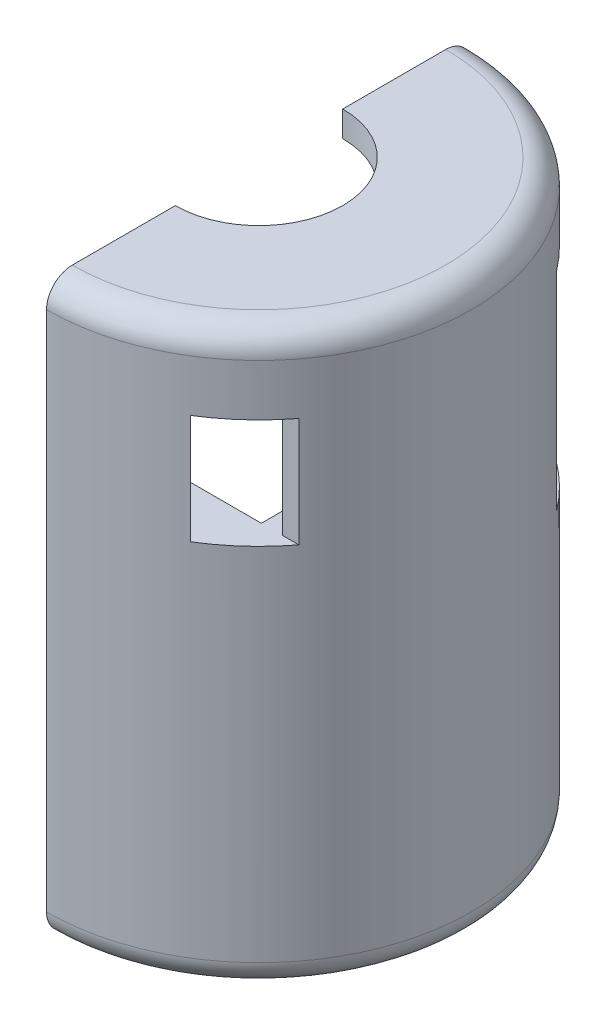
ISO-10303-21;
HEADER;
FILE_DESCRIPTION(('STEP AP214'),'2;1');
FILE_NAME('part.step','',(''),(''),'','','');
FILE_SCHEMA(('AUTOMOTIVE_DESIGN { 1 0 10303 214 1 1 1 1 }'));
ENDSEC;
DATA;
#1=APPLICATION_CONTEXT('core data for automotive mechanical design processes');
#2=APPLICATION_PROTOCOL_DEFINITION('international standard','automotive_design',2000,#1);
#3=PRODUCT_CONTEXT('',#1,'mechanical');
#4=PRODUCT('Part','Part','',(#3));
#5=PRODUCT_RELATED_PRODUCT_CATEGORY('part','',(#4));
#6=PRODUCT_DEFINITION_FORMATION('','',#4);
#7=PRODUCT_DEFINITION_CONTEXT('part definition',#1,'design');
#8=PRODUCT_DEFINITION('design','',#6,#7);
#9=PRODUCT_DEFINITION_SHAPE('','',#8);
#10=(LENGTH_UNIT() NAMED_UNIT(*) SI_UNIT(.MILLI.,.METRE.));
#11=(NAMED_UNIT(*) PLANE_ANGLE_UNIT() SI_UNIT($,.RADIAN.));
#12=(NAMED_UNIT(*) SI_UNIT($,.STERADIAN.) SOLID_ANGLE_UNIT());
#13=UNCERTAINTY_MEASURE_WITH_UNIT(LENGTH_MEASURE(1.E-05),#10,'distance_accuracy_value','');
#14=(GEOMETRIC_REPRESENTATION_CONTEXT(3) GLOBAL_UNCERTAINTY_ASSIGNED_CONTEXT((#13)) GLOBAL_UNIT_ASSIGNED_CONTEXT((#10,
#11,#12)) REPRESENTATION_CONTEXT('',''));
#15=CARTESIAN_POINT('',(0.,0.,0.));
#16=DIRECTION('',(0.,0.,1.));
#17=DIRECTION('',(1.,0.,0.));
#18=AXIS2_PLACEMENT_3D('',#15,#16,#17);
#19=CARTESIAN_POINT('',(88.,36.5,-4.));
#20=DIRECTION('',(0.,-1.,0.));
#21=DIRECTION('',(0.,0.,-1.));
#22=AXIS2_PLACEMENT_3D('',#19,#20,#21);
#23=PLANE('',#22);
#24=DIRECTION('',(0.,0.,-1.));
#25=VECTOR('',#24,1.);
#26=CARTESIAN_POINT('',(40.2,36.5,20.));
#27=LINE('',#26,#25);
#28=CARTESIAN_POINT('',(40.2,36.5,20.));
#29=VERTEX_POINT('',#28);
#30=CARTESIAN_POINT('',(40.2,36.5,0.));
#31=VERTEX_POINT('',#30);
#32=EDGE_CURVE('E188',#29,#31,#27,.T.);
#33=ORIENTED_EDGE('',*,*,#32,.T.);
#34=DIRECTION('',(-1.,0.,0.));
#35=VECTOR('',#34,1.);
#36=CARTESIAN_POINT('',(88.,36.5,0.));
#37=LINE('',#36,#35);
#38=CARTESIAN_POINT('',(30.,36.5,0.));
#39=VERTEX_POINT('',#38);
#40=EDGE_CURVE('E34',#31,#39,#37,.T.);
#41=ORIENTED_EDGE('',*,*,#40,.T.);
#42=DIRECTION('',(0.,0.,1.));
#43=VECTOR('',#42,1.);
#44=CARTESIAN_POINT('',(30.,36.5,-4.));
#45=LINE('',#44,#43);
#46=CARTESIAN_POINT('',(30.,36.5,-4.));
#47=VERTEX_POINT('',#46);
#48=EDGE_CURVE('E279',#47,#39,#45,.T.);
#49=ORIENTED_EDGE('',*,*,#48,.F.);
#50=DIRECTION('',(-1.,0.,0.));
#51=VECTOR('',#50,1.);
#52=CARTESIAN_POINT('',(88.,36.5,-4.));
#53=LINE('',#52,#51);
#54=CARTESIAN_POINT('',(38.7623643644877,36.5,-4.));
#55=VERTEX_POINT('',#54);
#56=EDGE_CURVE('E292',#47,#55,#53,.F.);
#57=ORIENTED_EDGE('',*,*,#56,.T.);
#58=CARTESIAN_POINT('',(30.,36.5,9.98109333149438));
#59=DIRECTION('',(0.,-1.,0.));
#60=DIRECTION('',(0.,0.,-1.));
#61=AXIS2_PLACEMENT_3D('',#58,#59,#60);
#62=CIRCLE('',#61,16.5);
#63=CARTESIAN_POINT('',(43.1387889817897,36.5,0.));
#64=VERTEX_POINT('',#63);
#65=EDGE_CURVE('E408',#64,#55,#62,.F.);
#66=ORIENTED_EDGE('',*,*,#65,.F.);
#67=DIRECTION('',(-1.,0.,0.));
#68=VECTOR('',#67,1.);
#69=CARTESIAN_POINT('',(88.,36.5,0.));
#70=LINE('',#69,#68);
#71=CARTESIAN_POINT('',(41.8586582676119,36.5,0.));
#72=VERTEX_POINT('',#71);
#73=EDGE_CURVE('E290',#72,#64,#70,.F.);
#74=ORIENTED_EDGE('',*,*,#73,.F.);
#75=CARTESIAN_POINT('',(30.,36.5,9.98109333149438));
#76=DIRECTION('',(0.,1.,0.));
#77=DIRECTION('',(0.,0.,1.));
#78=AXIS2_PLACEMENT_3D('',#75,#76,#77);
#79=CIRCLE('',#78,15.5);
#80=CARTESIAN_POINT('',(41.8267285911098,36.5,20.));
#81=VERTEX_POINT('',#80);
#82=EDGE_CURVE('E238',#81,#72,#79,.T.);
#83=ORIENTED_EDGE('',*,*,#82,.F.);
#84=DIRECTION('',(-1.,0.,0.));
#85=VECTOR('',#84,1.);
#86=CARTESIAN_POINT('',(88.,36.5,20.));
#87=LINE('',#86,#85);
#88=CARTESIAN_POINT('',(43.1099774663335,36.5,20.));
#89=VERTEX_POINT('',#88);
#90=EDGE_CURVE('E195',#81,#89,#87,.F.);
#91=ORIENTED_EDGE('',*,*,#90,.T.);
#92=CARTESIAN_POINT('',(30.,36.5,9.98109333149438));
#93=DIRECTION('',(0.,-1.,0.));
#94=DIRECTION('',(0.,0.,-1.));
#95=AXIS2_PLACEMENT_3D('',#92,#93,#94);
#96=CIRCLE('',#95,16.5);
#97=CARTESIAN_POINT('',(38.7017386664809,36.5,24.));
#98=VERTEX_POINT('',#97);
#99=EDGE_CURVE('E26',#98,#89,#96,.F.);
#100=ORIENTED_EDGE('',*,*,#99,.F.);
#101=DIRECTION('',(-1.,0.,0.));
#102=VECTOR('',#101,1.);
#103=CARTESIAN_POINT('',(88.,36.5,24.));
#104=LINE('',#103,#102);
#105=CARTESIAN_POINT('',(30.,36.5,24.));
#106=VERTEX_POINT('',#105);
#107=EDGE_CURVE('E267',#106,#98,#104,.F.);
#108=ORIENTED_EDGE('',*,*,#107,.F.);
#109=DIRECTION('',(0.,0.,1.));
#110=VECTOR('',#109,1.);
#111=CARTESIAN_POINT('',(30.,36.5,20.));
#112=LINE('',#111,#110);
#113=CARTESIAN_POINT('',(30.,36.5,20.));
#114=VERTEX_POINT('',#113);
#115=EDGE_CURVE('E190',#114,#106,#112,.T.);
#116=ORIENTED_EDGE('',*,*,#115,.F.);
#117=DIRECTION('',(-1.,0.,0.));
#118=VECTOR('',#117,1.);
#119=CARTESIAN_POINT('',(88.,36.5,20.));
#120=LINE('',#119,#118);
#121=EDGE_CURVE('E185',#29,#114,#120,.T.);
#122=ORIENTED_EDGE('',*,*,#121,.F.);
#123=EDGE_LOOP('',(#33,#41,#49,#57,#66,#74,#83,#91,#100,#108,#116,#122));
#124=FACE_BOUND('',#123,.T.);
#125=ADVANCED_FACE('F16',(#124),#23,.T.);
#126=CARTESIAN_POINT('',(88.,28.,24.));
#127=DIRECTION('',(0.,1.,0.));
#128=DIRECTION('',(0.,0.,1.));
#129=AXIS2_PLACEMENT_3D('',#126,#127,#128);
#130=PLANE('',#129);
#131=DIRECTION('',(0.,0.,1.));
#132=VECTOR('',#131,1.);
#133=CARTESIAN_POINT('',(40.2,28.,0.));
#134=LINE('',#133,#132);
#135=CARTESIAN_POINT('',(40.2,28.,0.));
#136=VERTEX_POINT('',#135);
#137=CARTESIAN_POINT('',(40.2,28.,20.));
#138=VERTEX_POINT('',#137);
#139=EDGE_CURVE('E207',#136,#138,#134,.T.);
#140=ORIENTED_EDGE('',*,*,#139,.T.);
#141=DIRECTION('',(-1.,0.,0.));
#142=VECTOR('',#141,1.);
#143=CARTESIAN_POINT('',(88.,28.,20.));
#144=LINE('',#143,#142);
#145=CARTESIAN_POINT('',(30.,28.,20.));
#146=VERTEX_POINT('',#145);
#147=EDGE_CURVE('E42',#138,#146,#144,.T.);
#148=ORIENTED_EDGE('',*,*,#147,.T.);
#149=DIRECTION('',(0.,0.,-1.));
#150=VECTOR('',#149,1.);
#151=CARTESIAN_POINT('',(30.,28.,24.));
#152=LINE('',#151,#150);
#153=CARTESIAN_POINT('',(30.,28.,24.));
#154=VERTEX_POINT('',#153);
#155=EDGE_CURVE('E196',#154,#146,#152,.T.);
#156=ORIENTED_EDGE('',*,*,#155,.F.);
#157=DIRECTION('',(-1.,0.,0.));
#158=VECTOR('',#157,1.);
#159=CARTESIAN_POINT('',(88.,28.,24.));
#160=LINE('',#159,#158);
#161=CARTESIAN_POINT('',(38.7017386664809,28.,24.));
#162=VERTEX_POINT('',#161);
#163=EDGE_CURVE('E263',#154,#162,#160,.F.);
#164=ORIENTED_EDGE('',*,*,#163,.T.);
#165=CARTESIAN_POINT('',(30.,28.,9.98109333149438));
#166=DIRECTION('',(0.,1.,0.));
#167=DIRECTION('',(0.,0.,1.));
#168=AXIS2_PLACEMENT_3D('',#165,#166,#167);
#169=CIRCLE('',#168,16.5);
#170=CARTESIAN_POINT('',(43.1099774663335,28.,20.));
#171=VERTEX_POINT('',#170);
#172=EDGE_CURVE('E424',#171,#162,#169,.F.);
#173=ORIENTED_EDGE('',*,*,#172,.F.);
#174=DIRECTION('',(-1.,0.,0.));
#175=VECTOR('',#174,1.);
#176=CARTESIAN_POINT('',(88.,28.,20.));
#177=LINE('',#176,#175);
#178=CARTESIAN_POINT('',(41.8267285911098,28.,20.));
#179=VERTEX_POINT('',#178);
#180=EDGE_CURVE('E262',#179,#171,#177,.F.);
#181=ORIENTED_EDGE('',*,*,#180,.F.);
#182=CARTESIAN_POINT('',(30.,28.,9.98109333149438));
#183=DIRECTION('',(0.,1.,0.));
#184=DIRECTION('',(0.,0.,1.));
#185=AXIS2_PLACEMENT_3D('',#182,#183,#184);
#186=CIRCLE('',#185,15.5);
#187=CARTESIAN_POINT('',(41.8586582676119,28.,0.));
#188=VERTEX_POINT('',#187);
#189=EDGE_CURVE('E237',#179,#188,#186,.T.);
#190=ORIENTED_EDGE('',*,*,#189,.T.);
#191=DIRECTION('',(1.,0.,0.));
#192=VECTOR('',#191,1.);
#193=CARTESIAN_POINT('',(88.,28.,0.));
#194=LINE('',#193,#192);
#195=EDGE_CURVE('E241',#136,#188,#194,.T.);
#196=ORIENTED_EDGE('',*,*,#195,.F.);
#197=EDGE_LOOP('',(#140,#148,#156,#164,#173,#181,#190,#196));
#198=FACE_BOUND('',#197,.T.);
#199=ADVANCED_FACE('F806',(#198),#130,.T.);
#200=CARTESIAN_POINT('',(88.,28.,0.));
#201=DIRECTION('',(0.,0.,-1.));
#202=DIRECTION('',(-1.,0.,0.));
#203=AXIS2_PLACEMENT_3D('',#200,#201,#202);
#204=PLANE('',#203);
#205=DIRECTION('',(0.,1.,0.));
#206=VECTOR('',#205,1.);
#207=CARTESIAN_POINT('',(40.2,0.,0.));
#208=LINE('',#207,#206);
#209=CARTESIAN_POINT('',(40.2,20.3440550447756,0.));
#210=VERTEX_POINT('',#209);
#211=EDGE_CURVE('E226',#136,#210,#208,.F.);
#212=ORIENTED_EDGE('',*,*,#211,.F.);
#213=ORIENTED_EDGE('',*,*,#195,.T.);
#214=DIRECTION('',(0.,-1.,0.));
#215=VECTOR('',#214,1.);
#216=CARTESIAN_POINT('',(41.8586582676119,36.5,0.));
#217=LINE('',#216,#215);
#218=EDGE_CURVE('E247',#188,#72,#217,.F.);
#219=ORIENTED_EDGE('',*,*,#218,.T.);
#220=ORIENTED_EDGE('',*,*,#73,.T.);
#221=DIRECTION('',(0.,-1.,0.));
#222=VECTOR('',#221,1.);
#223=CARTESIAN_POINT('',(43.1387889817897,42.5,0.));
#224=LINE('',#223,#222);
#225=CARTESIAN_POINT('',(43.1387889817897,20.3440550447756,0.));
#226=VERTEX_POINT('',#225);
#227=EDGE_CURVE('E404',#226,#64,#224,.F.);
#228=ORIENTED_EDGE('',*,*,#227,.F.);
#229=DIRECTION('',(-1.,0.,0.));
#230=VECTOR('',#229,1.);
#231=CARTESIAN_POINT('',(88.,20.3440550447756,0.));
#232=LINE('',#231,#230);
#233=EDGE_CURVE('E300',#210,#226,#232,.F.);
#234=ORIENTED_EDGE('',*,*,#233,.F.);
#235=EDGE_LOOP('',(#212,#213,#219,#220,#228,#234));
#236=FACE_BOUND('',#235,.T.);
#237=ADVANCED_FACE('F630',(#236),#204,.T.);
#238=CARTESIAN_POINT('',(88.,28.,20.));
#239=DIRECTION('',(0.,0.,1.));
#240=DIRECTION('',(1.,0.,0.));
#241=AXIS2_PLACEMENT_3D('',#238,#239,#240);
#242=PLANE('',#241);
#243=ORIENTED_EDGE('',*,*,#90,.F.);
#244=DIRECTION('',(0.,-1.,0.));
#245=VECTOR('',#244,1.);
#246=CARTESIAN_POINT('',(41.8267285911098,36.5,20.));
#247=LINE('',#246,#245);
#248=EDGE_CURVE('E10',#81,#179,#247,.T.);
#249=ORIENTED_EDGE('',*,*,#248,.T.);
#250=ORIENTED_EDGE('',*,*,#180,.T.);
#251=DIRECTION('',(0.,-1.,0.));
#252=VECTOR('',#251,1.);
#253=CARTESIAN_POINT('',(43.1099774663335,42.5,20.));
#254=LINE('',#253,#252);
#255=EDGE_CURVE('E416',#89,#171,#254,.T.);
#256=ORIENTED_EDGE('',*,*,#255,.F.);
#257=EDGE_LOOP('',(#243,#249,#250,#256));
#258=FACE_BOUND('',#257,.T.);
#259=ADVANCED_FACE('F625',(#258),#242,.T.);
#260=CARTESIAN_POINT('',(40.,40.5,20.));
#261=DIRECTION('',(0.,0.,-1.));
#262=DIRECTION('',(-1.,0.,0.));
#263=AXIS2_PLACEMENT_3D('',#260,#261,#262);
#264=PLANE('',#263);
#265=DIRECTION('',(-1.,0.,0.));
#266=VECTOR('',#265,1.);
#267=CARTESIAN_POINT('',(40.,40.5,20.));
#268=LINE('',#267,#266);
#269=CARTESIAN_POINT('',(30.,40.5,20.));
#270=VERTEX_POINT('',#269);
#271=CARTESIAN_POINT('',(40.2,40.5,20.));
#272=VERTEX_POINT('',#271);
#273=EDGE_CURVE('E202',#270,#272,#268,.F.);
#274=ORIENTED_EDGE('',*,*,#273,.T.);
#275=DIRECTION('',(0.,-1.,0.));
#276=VECTOR('',#275,1.);
#277=CARTESIAN_POINT('',(40.2,40.5,20.));
#278=LINE('',#277,#276);
#279=EDGE_CURVE('E199',#272,#29,#278,.T.);
#280=ORIENTED_EDGE('',*,*,#279,.T.);
#281=ORIENTED_EDGE('',*,*,#121,.T.);
#282=DIRECTION('',(0.,-1.,0.));
#283=VECTOR('',#282,1.);
#284=CARTESIAN_POINT('',(30.,40.5,20.));
#285=LINE('',#284,#283);
#286=EDGE_CURVE('E344',#270,#114,#285,.T.);
#287=ORIENTED_EDGE('',*,*,#286,.F.);
#288=EDGE_LOOP('',(#274,#280,#281,#287));
#289=FACE_BOUND('',#288,.T.);
#290=ADVANCED_FACE('F200',(#289),#264,.T.);
#291=CARTESIAN_POINT('',(30.,42.5,9.98109333149438));
#292=DIRECTION('',(0.,-1.,0.));
#293=DIRECTION('',(0.,0.,-1.));
#294=AXIS2_PLACEMENT_3D('',#291,#292,#293);
#295=CYLINDRICAL_SURFACE('',#294,16.5);
#296=DIRECTION('',(0.,-1.,0.));
#297=VECTOR('',#296,1.);
#298=CARTESIAN_POINT('',(30.,42.5,-6.51890666850562));
#299=LINE('',#298,#297);
#300=CARTESIAN_POINT('',(30.,40.5,-6.51890666850562));
#301=VERTEX_POINT('',#300);
#302=CARTESIAN_POINT('',(30.,0.,-6.51890666850562));
#303=VERTEX_POINT('',#302);
#304=EDGE_CURVE('E367',#301,#303,#299,.T.);
#305=ORIENTED_EDGE('',*,*,#304,.F.);
#306=CARTESIAN_POINT('',(30.,40.5,9.98109333149438));
#307=DIRECTION('',(0.,-1.,0.));
#308=DIRECTION('',(0.,0.,-1.));
#309=AXIS2_PLACEMENT_3D('',#306,#307,#308);
#310=CIRCLE('',#309,16.5);
#311=CARTESIAN_POINT('',(30.,40.5,26.4810933314944));
#312=VERTEX_POINT('',#311);
#313=EDGE_CURVE('E387',#301,#312,#310,.T.);
#314=ORIENTED_EDGE('',*,*,#313,.T.);
#315=DIRECTION('',(0.,-1.,0.));
#316=VECTOR('',#315,1.);
#317=CARTESIAN_POINT('',(30.,42.5,26.4810933314944));
#318=LINE('',#317,#316);
#319=CARTESIAN_POINT('',(30.,0.,26.4810933314944));
#320=VERTEX_POINT('',#319);
#321=EDGE_CURVE('E362',#320,#312,#318,.F.);
#322=ORIENTED_EDGE('',*,*,#321,.F.);
#323=CARTESIAN_POINT('',(30.,0.,9.98109333149438));
#324=DIRECTION('',(0.,-1.,0.));
#325=DIRECTION('',(0.,0.,-1.));
#326=AXIS2_PLACEMENT_3D('',#323,#324,#325);
#327=CIRCLE('',#326,16.5);
#328=EDGE_CURVE('E380',#320,#303,#327,.F.);
#329=ORIENTED_EDGE('',*,*,#328,.T.);
#330=EDGE_LOOP('',(#305,#314,#322,#329));
#331=FACE_BOUND('',#330,.T.);
#332=ORIENTED_EDGE('',*,*,#65,.T.);
#333=DIRECTION('',(0.,-1.,0.));
#334=VECTOR('',#333,1.);
#335=CARTESIAN_POINT('',(38.7623643644877,42.5,-4.));
#336=LINE('',#335,#334);
#337=CARTESIAN_POINT('',(38.7623643644877,20.3440550447756,-4.));
#338=VERTEX_POINT('',#337);
#339=EDGE_CURVE('E412',#55,#338,#336,.T.);
#340=ORIENTED_EDGE('',*,*,#339,.T.);
#341=CARTESIAN_POINT('',(30.,20.3440550447756,9.98109333149438));
#342=DIRECTION('',(0.,1.,0.));
#343=DIRECTION('',(0.,0.,1.));
#344=AXIS2_PLACEMENT_3D('',#341,#342,#343);
#345=CIRCLE('',#344,16.5);
#346=EDGE_CURVE('E400',#338,#226,#345,.F.);
#347=ORIENTED_EDGE('',*,*,#346,.T.);
#348=ORIENTED_EDGE('',*,*,#227,.T.);
#349=EDGE_LOOP('',(#332,#340,#347,#348));
#350=FACE_BOUND('',#349,.T.);
#351=DIRECTION('',(0.,-1.,0.));
#352=VECTOR('',#351,1.);
#353=CARTESIAN_POINT('',(38.7017386664809,42.5,24.));
#354=LINE('',#353,#352);
#355=EDGE_CURVE('E270',#162,#98,#354,.F.);
#356=ORIENTED_EDGE('',*,*,#355,.T.);
#357=ORIENTED_EDGE('',*,*,#99,.T.);
#358=ORIENTED_EDGE('',*,*,#255,.T.);
#359=ORIENTED_EDGE('',*,*,#172,.T.);
#360=EDGE_LOOP('',(#356,#357,#358,#359));
#361=FACE_BOUND('',#360,.T.);
#362=ADVANCED_FACE('F608',(#331,#350,#361),#295,.T.);
#363=CARTESIAN_POINT('',(30.,42.5,26.4810933314944));
#364=DIRECTION('',(-1.,0.,0.));
#365=DIRECTION('',(0.,0.,1.));
#366=AXIS2_PLACEMENT_3D('',#363,#364,#365);
#367=PLANE('',#366);
#368=ORIENTED_EDGE('',*,*,#286,.T.);
#369=ORIENTED_EDGE('',*,*,#115,.T.);
#370=DIRECTION('',(0.,-1.,0.));
#371=VECTOR('',#370,1.);
#372=CARTESIAN_POINT('',(30.,36.5,24.));
#373=LINE('',#372,#371);
#374=EDGE_CURVE('E253',#106,#154,#373,.T.);
#375=ORIENTED_EDGE('',*,*,#374,.T.);
#376=ORIENTED_EDGE('',*,*,#155,.T.);
#377=CARTESIAN_POINT('',(30.,0.,20.));
#378=VERTEX_POINT('',#377);
#379=EDGE_CURVE('E343',#146,#378,#285,.T.);
#380=ORIENTED_EDGE('',*,*,#379,.T.);
#381=DIRECTION('',(0.,0.,-1.));
#382=VECTOR('',#381,1.);
#383=CARTESIAN_POINT('',(30.,0.,20.));
#384=LINE('',#383,#382);
#385=CARTESIAN_POINT('',(30.,0.,16.4810933314944));
#386=VERTEX_POINT('',#385);
#387=EDGE_CURVE('E329',#378,#386,#384,.T.);
#388=ORIENTED_EDGE('',*,*,#387,.T.);
#389=DIRECTION('',(0.,-1.,0.));
#390=VECTOR('',#389,1.);
#391=CARTESIAN_POINT('',(30.,0.,16.4810933314944));
#392=LINE('',#391,#390);
#393=CARTESIAN_POINT('',(30.,-2.,16.4810933314944));
#394=VERTEX_POINT('',#393);
#395=EDGE_CURVE('E319',#394,#386,#392,.F.);
#396=ORIENTED_EDGE('',*,*,#395,.F.);
#397=DIRECTION('',(0.,0.,-1.));
#398=VECTOR('',#397,1.);
#399=CARTESIAN_POINT('',(30.,-2.,26.4810933314944));
#400=LINE('',#399,#398);
#401=CARTESIAN_POINT('',(30.,-2.,24.4810933314944));
#402=VERTEX_POINT('',#401);
#403=EDGE_CURVE('E364',#402,#394,#400,.T.);
#404=ORIENTED_EDGE('',*,*,#403,.F.);
#405=CARTESIAN_POINT('',(30.,0.,24.4810933314944));
#406=DIRECTION('',(-1.,0.,0.));
#407=DIRECTION('',(0.,0.,1.));
#408=AXIS2_PLACEMENT_3D('',#405,#406,#407);
#409=CIRCLE('',#408,2.);
#410=EDGE_CURVE('E377',#402,#320,#409,.T.);
#411=ORIENTED_EDGE('',*,*,#410,.T.);
#412=ORIENTED_EDGE('',*,*,#321,.T.);
#413=CARTESIAN_POINT('',(30.,40.5,24.4810933314944));
#414=DIRECTION('',(-1.,0.,0.));
#415=DIRECTION('',(0.,0.,1.));
#416=AXIS2_PLACEMENT_3D('',#413,#414,#415);
#417=CIRCLE('',#416,2.);
#418=CARTESIAN_POINT('',(30.,42.5,24.4810933314944));
#419=VERTEX_POINT('',#418);
#420=EDGE_CURVE('E391',#312,#419,#417,.T.);
#421=ORIENTED_EDGE('',*,*,#420,.T.);
#422=DIRECTION('',(0.,0.,-1.));
#423=VECTOR('',#422,1.);
#424=CARTESIAN_POINT('',(30.,42.5,26.4810933314944));
#425=LINE('',#424,#423);
#426=CARTESIAN_POINT('',(30.,42.5,16.4810933314944));
#427=VERTEX_POINT('',#426);
#428=EDGE_CURVE('E359',#419,#427,#425,.T.);
#429=ORIENTED_EDGE('',*,*,#428,.T.);
#430=DIRECTION('',(0.,1.,0.));
#431=VECTOR('',#430,1.);
#432=CARTESIAN_POINT('',(30.,40.5,16.4810933314944));
#433=LINE('',#432,#431);
#434=CARTESIAN_POINT('',(30.,40.5,16.4810933314944));
#435=VERTEX_POINT('',#434);
#436=EDGE_CURVE('E310',#435,#427,#433,.T.);
#437=ORIENTED_EDGE('',*,*,#436,.F.);
#438=DIRECTION('',(0.,0.,1.));
#439=VECTOR('',#438,1.);
#440=CARTESIAN_POINT('',(30.,40.5,0.));
#441=LINE('',#440,#439);
#442=EDGE_CURVE('E338',#435,#270,#441,.T.);
#443=ORIENTED_EDGE('',*,*,#442,.T.);
#444=EDGE_LOOP('',(#368,#369,#375,#376,#380,#388,#396,#404,#411,#412,#421,#429,#437,#443));
#445=FACE_BOUND('',#444,.T.);
#446=ADVANCED_FACE('F604',(#445),#367,.T.);
#447=CARTESIAN_POINT('',(40.,0.,0.));
#448=DIRECTION('',(0.,0.,1.));
#449=DIRECTION('',(1.,0.,0.));
#450=AXIS2_PLACEMENT_3D('',#447,#448,#449);
#451=PLANE('',#450);
#452=DIRECTION('',(-1.,0.,0.));
#453=VECTOR('',#452,1.);
#454=CARTESIAN_POINT('',(40.,0.,0.));
#455=LINE('',#454,#453);
#456=CARTESIAN_POINT('',(30.,0.,0.));
#457=VERTEX_POINT('',#456);
#458=CARTESIAN_POINT('',(40.2,0.,0.));
#459=VERTEX_POINT('',#458);
#460=EDGE_CURVE('E353',#457,#459,#455,.F.);
#461=ORIENTED_EDGE('',*,*,#460,.T.);
#462=EDGE_CURVE('E225',#210,#459,#208,.F.);
#463=ORIENTED_EDGE('',*,*,#462,.F.);
#464=DIRECTION('',(-1.,0.,0.));
#465=VECTOR('',#464,1.);
#466=CARTESIAN_POINT('',(88.,20.3440550447756,0.));
#467=LINE('',#466,#465);
#468=CARTESIAN_POINT('',(30.,20.3440550447756,0.));
#469=VERTEX_POINT('',#468);
#470=EDGE_CURVE('E291',#210,#469,#467,.T.);
#471=ORIENTED_EDGE('',*,*,#470,.T.);
#472=DIRECTION('',(0.,1.,0.));
#473=VECTOR('',#472,1.);
#474=CARTESIAN_POINT('',(30.,0.,0.));
#475=LINE('',#474,#473);
#476=EDGE_CURVE('E334',#457,#469,#475,.T.);
#477=ORIENTED_EDGE('',*,*,#476,.F.);
#478=EDGE_LOOP('',(#461,#463,#471,#477));
#479=FACE_BOUND('',#478,.T.);
#480=ADVANCED_FACE('F440',(#479),#451,.T.);
#481=ORIENTED_EDGE('',*,*,#476,.T.);
#482=DIRECTION('',(0.,0.,-1.));
#483=VECTOR('',#482,1.);
#484=CARTESIAN_POINT('',(30.,20.3440550447756,0.));
#485=LINE('',#484,#483);
#486=CARTESIAN_POINT('',(30.,20.3440550447756,-4.));
#487=VERTEX_POINT('',#486);
#488=EDGE_CURVE('E283',#469,#487,#485,.T.);
#489=ORIENTED_EDGE('',*,*,#488,.T.);
#490=DIRECTION('',(0.,1.,0.));
#491=VECTOR('',#490,1.);
#492=CARTESIAN_POINT('',(30.,28.,-4.));
#493=LINE('',#492,#491);
#494=EDGE_CURVE('E275',#487,#47,#493,.T.);
#495=ORIENTED_EDGE('',*,*,#494,.T.);
#496=ORIENTED_EDGE('',*,*,#48,.T.);
#497=CARTESIAN_POINT('',(30.,40.5,0.));
#498=VERTEX_POINT('',#497);
#499=EDGE_CURVE('E333',#39,#498,#475,.T.);
#500=ORIENTED_EDGE('',*,*,#499,.T.);
#501=CARTESIAN_POINT('',(30.,40.5,3.48109333149438));
#502=VERTEX_POINT('',#501);
#503=EDGE_CURVE('E339',#498,#502,#441,.T.);
#504=ORIENTED_EDGE('',*,*,#503,.T.);
#505=DIRECTION('',(0.,1.,0.));
#506=VECTOR('',#505,1.);
#507=CARTESIAN_POINT('',(30.,40.5,3.48109333149438));
#508=LINE('',#507,#506);
#509=CARTESIAN_POINT('',(30.,42.5,3.48109333149438));
#510=VERTEX_POINT('',#509);
#511=EDGE_CURVE('E305',#510,#502,#508,.F.);
#512=ORIENTED_EDGE('',*,*,#511,.F.);
#513=CARTESIAN_POINT('',(30.,42.5,-4.51890666850562));
#514=VERTEX_POINT('',#513);
#515=EDGE_CURVE('E363',#510,#514,#425,.T.);
#516=ORIENTED_EDGE('',*,*,#515,.T.);
#517=CARTESIAN_POINT('',(30.,40.5,-4.51890666850562));
#518=DIRECTION('',(-1.,0.,0.));
#519=DIRECTION('',(0.,0.,1.));
#520=AXIS2_PLACEMENT_3D('',#517,#518,#519);
#521=CIRCLE('',#520,2.);
#522=EDGE_CURVE('E397',#514,#301,#521,.T.);
#523=ORIENTED_EDGE('',*,*,#522,.T.);
#524=ORIENTED_EDGE('',*,*,#304,.T.);
#525=CARTESIAN_POINT('',(30.,0.,-4.51890666850562));
#526=DIRECTION('',(-1.,0.,0.));
#527=DIRECTION('',(0.,0.,1.));
#528=AXIS2_PLACEMENT_3D('',#525,#526,#527);
#529=CIRCLE('',#528,2.);
#530=CARTESIAN_POINT('',(30.,-2.,-4.51890666850562));
#531=VERTEX_POINT('',#530);
#532=EDGE_CURVE('E384',#303,#531,#529,.T.);
#533=ORIENTED_EDGE('',*,*,#532,.T.);
#534=CARTESIAN_POINT('',(30.,-2.,3.48109333149438));
#535=VERTEX_POINT('',#534);
#536=EDGE_CURVE('E356',#535,#531,#400,.T.);
#537=ORIENTED_EDGE('',*,*,#536,.F.);
#538=DIRECTION('',(0.,-1.,0.));
#539=VECTOR('',#538,1.);
#540=CARTESIAN_POINT('',(30.,0.,3.48109333149438));
#541=LINE('',#540,#539);
#542=CARTESIAN_POINT('',(30.,0.,3.48109333149438));
#543=VERTEX_POINT('',#542);
#544=EDGE_CURVE('E325',#543,#535,#541,.T.);
#545=ORIENTED_EDGE('',*,*,#544,.F.);
#546=EDGE_CURVE('E328',#543,#457,#384,.T.);
#547=ORIENTED_EDGE('',*,*,#546,.T.);
#548=EDGE_LOOP('',(#481,#489,#495,#496,#500,#504,#512,#516,#523,#524,#533,#537,#545,#547));
#549=FACE_BOUND('',#548,.T.);
#550=ADVANCED_FACE('F447',(#549),#367,.T.);
#551=CARTESIAN_POINT('',(30.,42.5,9.98109333149438));
#552=DIRECTION('',(0.,-1.,0.));
#553=DIRECTION('',(0.,0.,-1.));
#554=AXIS2_PLACEMENT_3D('',#551,#552,#553);
#555=PLANE('',#554);
#556=ORIENTED_EDGE('',*,*,#428,.F.);
#557=CARTESIAN_POINT('',(30.,42.5,9.98109333149438));
#558=DIRECTION('',(0.,-1.,0.));
#559=DIRECTION('',(0.,0.,-1.));
#560=AXIS2_PLACEMENT_3D('',#557,#558,#559);
#561=CIRCLE('',#560,14.5);
#562=EDGE_CURVE('E394',#419,#514,#561,.F.);
#563=ORIENTED_EDGE('',*,*,#562,.T.);
#564=ORIENTED_EDGE('',*,*,#515,.F.);
#565=CARTESIAN_POINT('',(30.,42.5,9.98109333149438));
#566=DIRECTION('',(0.,1.,0.));
#567=DIRECTION('',(0.,0.,1.));
#568=AXIS2_PLACEMENT_3D('',#565,#566,#567);
#569=CIRCLE('',#568,6.5);
#570=EDGE_CURVE('E296',#427,#510,#569,.T.);
#571=ORIENTED_EDGE('',*,*,#570,.F.);
#572=EDGE_LOOP('',(#556,#563,#564,#571));
#573=FACE_BOUND('',#572,.T.);
#574=ADVANCED_FACE('F530',(#573),#555,.F.);
#575=CARTESIAN_POINT('',(40.,40.5,0.));
#576=DIRECTION('',(0.,-1.,0.));
#577=DIRECTION('',(0.,0.,-1.));
#578=AXIS2_PLACEMENT_3D('',#575,#576,#577);
#579=PLANE('',#578);
#580=ORIENTED_EDGE('',*,*,#442,.F.);
#581=CARTESIAN_POINT('',(30.,40.5,9.98109333149438));
#582=DIRECTION('',(0.,1.,0.));
#583=DIRECTION('',(0.,0.,1.));
#584=AXIS2_PLACEMENT_3D('',#581,#582,#583);
#585=CIRCLE('',#584,6.5);
#586=EDGE_CURVE('E301',#435,#502,#585,.T.);
#587=ORIENTED_EDGE('',*,*,#586,.T.);
#588=ORIENTED_EDGE('',*,*,#503,.F.);
#589=DIRECTION('',(-1.,0.,0.));
#590=VECTOR('',#589,1.);
#591=CARTESIAN_POINT('',(40.,40.5,0.));
#592=LINE('',#591,#590);
#593=CARTESIAN_POINT('',(40.2,40.5,0.));
#594=VERTEX_POINT('',#593);
#595=EDGE_CURVE('E350',#498,#594,#592,.F.);
#596=ORIENTED_EDGE('',*,*,#595,.T.);
#597=DIRECTION('',(0.,0.,1.));
#598=VECTOR('',#597,1.);
#599=CARTESIAN_POINT('',(40.2,40.5,0.));
#600=LINE('',#599,#598);
#601=EDGE_CURVE('E208',#594,#272,#600,.T.);
#602=ORIENTED_EDGE('',*,*,#601,.T.);
#603=ORIENTED_EDGE('',*,*,#273,.F.);
#604=EDGE_LOOP('',(#580,#587,#588,#596,#602,#603));
#605=FACE_BOUND('',#604,.T.);
#606=ADVANCED_FACE('F535',(#605),#579,.T.);
#607=CARTESIAN_POINT('',(40.,0.,20.));
#608=DIRECTION('',(0.,1.,0.));
#609=DIRECTION('',(0.,0.,1.));
#610=AXIS2_PLACEMENT_3D('',#607,#608,#609);
#611=PLANE('',#610);
#612=ORIENTED_EDGE('',*,*,#546,.F.);
#613=CARTESIAN_POINT('',(30.,0.,9.98109333149438));
#614=DIRECTION('',(0.,-1.,0.));
#615=DIRECTION('',(0.,0.,-1.));
#616=AXIS2_PLACEMENT_3D('',#613,#614,#615);
#617=CIRCLE('',#616,6.5);
#618=EDGE_CURVE('E315',#543,#386,#617,.T.);
#619=ORIENTED_EDGE('',*,*,#618,.T.);
#620=ORIENTED_EDGE('',*,*,#387,.F.);
#621=DIRECTION('',(-1.,0.,0.));
#622=VECTOR('',#621,1.);
#623=CARTESIAN_POINT('',(40.,0.,20.));
#624=LINE('',#623,#622);
#625=CARTESIAN_POINT('',(40.2,0.,20.));
#626=VERTEX_POINT('',#625);
#627=EDGE_CURVE('E347',#378,#626,#624,.F.);
#628=ORIENTED_EDGE('',*,*,#627,.T.);
#629=DIRECTION('',(0.,0.,-1.));
#630=VECTOR('',#629,1.);
#631=CARTESIAN_POINT('',(40.2,0.,20.));
#632=LINE('',#631,#630);
#633=EDGE_CURVE('E230',#459,#626,#632,.F.);
#634=ORIENTED_EDGE('',*,*,#633,.F.);
#635=ORIENTED_EDGE('',*,*,#460,.F.);
#636=EDGE_LOOP('',(#612,#619,#620,#628,#634,#635));
#637=FACE_BOUND('',#636,.T.);
#638=ADVANCED_FACE('F506',(#637),#611,.T.);
#639=CARTESIAN_POINT('',(30.,-2.,9.98109333149438));
#640=DIRECTION('',(0.,-1.,0.));
#641=DIRECTION('',(0.,0.,-1.));
#642=AXIS2_PLACEMENT_3D('',#639,#640,#641);
#643=PLANE('',#642);
#644=ORIENTED_EDGE('',*,*,#536,.T.);
#645=CARTESIAN_POINT('',(30.,-2.,9.98109333149438));
#646=DIRECTION('',(0.,-1.,0.));
#647=DIRECTION('',(0.,0.,-1.));
#648=AXIS2_PLACEMENT_3D('',#645,#646,#647);
#649=CIRCLE('',#648,14.5);
#650=EDGE_CURVE('E370',#531,#402,#649,.T.);
#651=ORIENTED_EDGE('',*,*,#650,.T.);
#652=ORIENTED_EDGE('',*,*,#403,.T.);
#653=CARTESIAN_POINT('',(30.,-2.,9.98109333149438));
#654=DIRECTION('',(0.,-1.,0.));
#655=DIRECTION('',(0.,0.,-1.));
#656=AXIS2_PLACEMENT_3D('',#653,#654,#655);
#657=CIRCLE('',#656,6.5);
#658=EDGE_CURVE('E314',#535,#394,#657,.T.);
#659=ORIENTED_EDGE('',*,*,#658,.F.);
#660=EDGE_LOOP('',(#644,#651,#652,#659));
#661=FACE_BOUND('',#660,.T.);
#662=ADVANCED_FACE('F500',(#661),#643,.T.);
#663=ORIENTED_EDGE('',*,*,#40,.F.);
#664=DIRECTION('',(0.,1.,0.));
#665=VECTOR('',#664,1.);
#666=CARTESIAN_POINT('',(40.2,36.5,0.));
#667=LINE('',#666,#665);
#668=EDGE_CURVE('E211',#31,#594,#667,.T.);
#669=ORIENTED_EDGE('',*,*,#668,.T.);
#670=ORIENTED_EDGE('',*,*,#595,.F.);
#671=ORIENTED_EDGE('',*,*,#499,.F.);
#672=EDGE_LOOP('',(#663,#669,#670,#671));
#673=FACE_BOUND('',#672,.T.);
#674=ADVANCED_FACE('F505',(#673),#451,.T.);
#675=ORIENTED_EDGE('',*,*,#147,.F.);
#676=DIRECTION('',(0.,-1.,0.));
#677=VECTOR('',#676,1.);
#678=CARTESIAN_POINT('',(40.2,40.5,20.));
#679=LINE('',#678,#677);
#680=EDGE_CURVE('E234',#626,#138,#679,.F.);
#681=ORIENTED_EDGE('',*,*,#680,.F.);
#682=ORIENTED_EDGE('',*,*,#627,.F.);
#683=ORIENTED_EDGE('',*,*,#379,.F.);
#684=EDGE_LOOP('',(#675,#681,#682,#683));
#685=FACE_BOUND('',#684,.T.);
#686=ADVANCED_FACE('F467',(#685),#264,.T.);
#687=CARTESIAN_POINT('',(30.,0.,9.98109333149438));
#688=DIRECTION('',(0.,-1.,0.));
#689=DIRECTION('',(0.,0.,-1.));
#690=AXIS2_PLACEMENT_3D('',#687,#688,#689);
#691=CYLINDRICAL_SURFACE('',#690,6.5);
#692=ORIENTED_EDGE('',*,*,#544,.T.);
#693=ORIENTED_EDGE('',*,*,#658,.T.);
#694=ORIENTED_EDGE('',*,*,#395,.T.);
#695=ORIENTED_EDGE('',*,*,#618,.F.);
#696=EDGE_LOOP('',(#692,#693,#694,#695));
#697=FACE_BOUND('',#696,.T.);
#698=ADVANCED_FACE('F462',(#697),#691,.F.);
#699=CARTESIAN_POINT('',(30.,40.5,9.98109333149438));
#700=DIRECTION('',(0.,1.,0.));
#701=DIRECTION('',(0.,0.,1.));
#702=AXIS2_PLACEMENT_3D('',#699,#700,#701);
#703=CYLINDRICAL_SURFACE('',#702,6.5);
#704=ORIENTED_EDGE('',*,*,#436,.T.);
#705=ORIENTED_EDGE('',*,*,#570,.T.);
#706=ORIENTED_EDGE('',*,*,#511,.T.);
#707=ORIENTED_EDGE('',*,*,#586,.F.);
#708=EDGE_LOOP('',(#704,#705,#706,#707));
#709=FACE_BOUND('',#708,.T.);
#710=ADVANCED_FACE('F466',(#709),#703,.F.);
#711=CARTESIAN_POINT('',(30.,0.,9.98109333149438));
#712=DIRECTION('',(0.,-1.,0.));
#713=DIRECTION('',(0.,0.,-1.));
#714=AXIS2_PLACEMENT_3D('',#711,#712,#713);
#715=TOROIDAL_SURFACE('',#714,14.5,2.);
#716=ORIENTED_EDGE('',*,*,#532,.F.);
#717=ORIENTED_EDGE('',*,*,#328,.F.);
#718=ORIENTED_EDGE('',*,*,#410,.F.);
#719=ORIENTED_EDGE('',*,*,#650,.F.);
#720=EDGE_LOOP('',(#716,#717,#718,#719));
#721=FACE_BOUND('',#720,.T.);
#722=ADVANCED_FACE('F486',(#721),#715,.T.);
#723=CARTESIAN_POINT('',(30.,40.5,9.98109333149438));
#724=DIRECTION('',(0.,-1.,0.));
#725=DIRECTION('',(0.,0.,-1.));
#726=AXIS2_PLACEMENT_3D('',#723,#724,#725);
#727=TOROIDAL_SURFACE('',#726,14.5,2.);
#728=ORIENTED_EDGE('',*,*,#522,.F.);
#729=ORIENTED_EDGE('',*,*,#562,.F.);
#730=ORIENTED_EDGE('',*,*,#420,.F.);
#731=ORIENTED_EDGE('',*,*,#313,.F.);
#732=EDGE_LOOP('',(#728,#729,#730,#731));
#733=FACE_BOUND('',#732,.T.);
#734=ADVANCED_FACE('F18',(#733),#727,.T.);
#735=CARTESIAN_POINT('',(88.,28.,-4.));
#736=DIRECTION('',(0.,0.,1.));
#737=DIRECTION('',(1.,0.,0.));
#738=AXIS2_PLACEMENT_3D('',#735,#736,#737);
#739=PLANE('',#738);
#740=ORIENTED_EDGE('',*,*,#56,.F.);
#741=ORIENTED_EDGE('',*,*,#494,.F.);
#742=DIRECTION('',(-1.,0.,0.));
#743=VECTOR('',#742,1.);
#744=CARTESIAN_POINT('',(88.,20.3440550447756,-4.));
#745=LINE('',#744,#743);
#746=EDGE_CURVE('E287',#487,#338,#745,.F.);
#747=ORIENTED_EDGE('',*,*,#746,.T.);
#748=ORIENTED_EDGE('',*,*,#339,.F.);
#749=EDGE_LOOP('',(#740,#741,#747,#748));
#750=FACE_BOUND('',#749,.T.);
#751=ADVANCED_FACE('F544',(#750),#739,.T.);
#752=CARTESIAN_POINT('',(88.,20.3440550447756,0.));
#753=DIRECTION('',(0.,1.,0.));
#754=DIRECTION('',(0.,0.,1.));
#755=AXIS2_PLACEMENT_3D('',#752,#753,#754);
#756=PLANE('',#755);
#757=ORIENTED_EDGE('',*,*,#746,.F.);
#758=ORIENTED_EDGE('',*,*,#488,.F.);
#759=ORIENTED_EDGE('',*,*,#470,.F.);
#760=ORIENTED_EDGE('',*,*,#233,.T.);
#761=ORIENTED_EDGE('',*,*,#346,.F.);
#762=EDGE_LOOP('',(#757,#758,#759,#760,#761));
#763=FACE_BOUND('',#762,.T.);
#764=ADVANCED_FACE('F444',(#763),#756,.T.);
#765=CARTESIAN_POINT('',(88.,36.5,24.));
#766=DIRECTION('',(0.,0.,-1.));
#767=DIRECTION('',(-1.,0.,0.));
#768=AXIS2_PLACEMENT_3D('',#765,#766,#767);
#769=PLANE('',#768);
#770=ORIENTED_EDGE('',*,*,#163,.F.);
#771=ORIENTED_EDGE('',*,*,#374,.F.);
#772=ORIENTED_EDGE('',*,*,#107,.T.);
#773=ORIENTED_EDGE('',*,*,#355,.F.);
#774=EDGE_LOOP('',(#770,#771,#772,#773));
#775=FACE_BOUND('',#774,.T.);
#776=ADVANCED_FACE('F582',(#775),#769,.T.);
#777=CARTESIAN_POINT('',(30.,36.5,9.98109333149438));
#778=DIRECTION('',(0.,-1.,0.));
#779=DIRECTION('',(0.,0.,-1.));
#780=AXIS2_PLACEMENT_3D('',#777,#778,#779);
#781=CYLINDRICAL_SURFACE('',#780,15.5);
#782=ORIENTED_EDGE('',*,*,#189,.F.);
#783=ORIENTED_EDGE('',*,*,#248,.F.);
#784=ORIENTED_EDGE('',*,*,#82,.T.);
#785=ORIENTED_EDGE('',*,*,#218,.F.);
#786=EDGE_LOOP('',(#782,#783,#784,#785));
#787=FACE_BOUND('',#786,.T.);
#788=ADVANCED_FACE('F586',(#787),#781,.F.);
#789=CARTESIAN_POINT('',(40.2,0.,0.));
#790=DIRECTION('',(1.,0.,0.));
#791=DIRECTION('',(0.,0.,-1.));
#792=AXIS2_PLACEMENT_3D('',#789,#790,#791);
#793=PLANE('',#792);
#794=ORIENTED_EDGE('',*,*,#139,.F.);
#795=ORIENTED_EDGE('',*,*,#211,.T.);
#796=ORIENTED_EDGE('',*,*,#462,.T.);
#797=ORIENTED_EDGE('',*,*,#633,.T.);
#798=ORIENTED_EDGE('',*,*,#680,.T.);
#799=EDGE_LOOP('',(#794,#795,#796,#797,#798));
#800=FACE_BOUND('',#799,.T.);
#801=ADVANCED_FACE('F638',(#800),#793,.F.);
#802=CARTESIAN_POINT('',(40.2,0.,0.));
#803=DIRECTION('',(1.,0.,0.));
#804=DIRECTION('',(0.,0.,-1.));
#805=AXIS2_PLACEMENT_3D('',#802,#803,#804);
#806=PLANE('',#805);
#807=ORIENTED_EDGE('',*,*,#32,.F.);
#808=ORIENTED_EDGE('',*,*,#279,.F.);
#809=ORIENTED_EDGE('',*,*,#601,.F.);
#810=ORIENTED_EDGE('',*,*,#668,.F.);
#811=EDGE_LOOP('',(#807,#808,#809,#810));
#812=FACE_BOUND('',#811,.T.);
#813=ADVANCED_FACE('F210',(#812),#806,.F.);
#814=CLOSED_SHELL('',(#125,#199,#237,#259,#290,#362,#446,#480,#550,#574,#606,#638,#662,#674,
#686,#698,#710,#722,#734,#751,#764,#776,#788,#801,#813));
#815=MANIFOLD_SOLID_BREP('B1',#814);
#816=ADVANCED_BREP_SHAPE_REPRESENTATION('',(#18,#815),#14);
#817=SHAPE_DEFINITION_REPRESENTATION(#9,#816);
ENDSEC;
END-ISO-10303-21;
